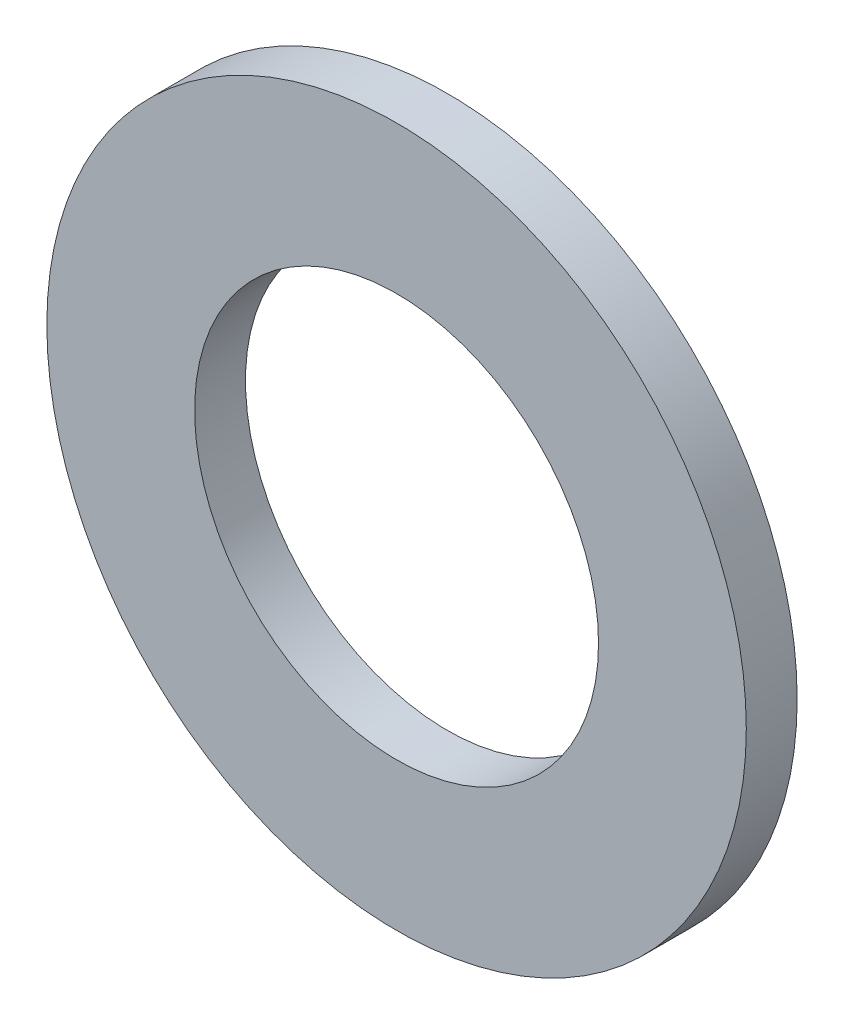
ISO-10303-21;
HEADER;
FILE_DESCRIPTION(('STEP AP214'),'2;1');
FILE_NAME('part.step','',(''),(''),'','','');
FILE_SCHEMA(('AUTOMOTIVE_DESIGN { 1 0 10303 214 1 1 1 1 }'));
ENDSEC;
DATA;
#1=APPLICATION_CONTEXT('core data for automotive mechanical design processes');
#2=APPLICATION_PROTOCOL_DEFINITION('international standard','automotive_design',2000,#1);
#3=PRODUCT_CONTEXT('',#1,'mechanical');
#4=PRODUCT('Part','Part','',(#3));
#5=PRODUCT_RELATED_PRODUCT_CATEGORY('part','',(#4));
#6=PRODUCT_DEFINITION_FORMATION('','',#4);
#7=PRODUCT_DEFINITION_CONTEXT('part definition',#1,'design');
#8=PRODUCT_DEFINITION('design','',#6,#7);
#9=PRODUCT_DEFINITION_SHAPE('','',#8);
#10=(LENGTH_UNIT() NAMED_UNIT(*) SI_UNIT(.MILLI.,.METRE.));
#11=(NAMED_UNIT(*) PLANE_ANGLE_UNIT() SI_UNIT($,.RADIAN.));
#12=(NAMED_UNIT(*) SI_UNIT($,.STERADIAN.) SOLID_ANGLE_UNIT());
#13=UNCERTAINTY_MEASURE_WITH_UNIT(LENGTH_MEASURE(1.E-05),#10,'distance_accuracy_value','');
#14=(GEOMETRIC_REPRESENTATION_CONTEXT(3) GLOBAL_UNCERTAINTY_ASSIGNED_CONTEXT((#13)) GLOBAL_UNIT_ASSIGNED_CONTEXT((#10,
#11,#12)) REPRESENTATION_CONTEXT('',''));
#15=CARTESIAN_POINT('',(0.,0.,0.));
#16=DIRECTION('',(0.,0.,1.));
#17=DIRECTION('',(1.,0.,0.));
#18=AXIS2_PLACEMENT_3D('',#15,#16,#17);
#19=CARTESIAN_POINT('',(0.,0.,-1.27));
#20=DIRECTION('',(0.,0.,1.));
#21=DIRECTION('',(1.,0.,0.));
#22=AXIS2_PLACEMENT_3D('',#19,#20,#21);
#23=CYLINDRICAL_SURFACE('',#22,8.73125);
#24=CARTESIAN_POINT('',(0.,0.,-1.27));
#25=DIRECTION('',(0.,0.,1.));
#26=DIRECTION('',(1.,0.,0.));
#27=AXIS2_PLACEMENT_3D('',#24,#25,#26);
#28=CIRCLE('',#27,8.73125);
#29=CARTESIAN_POINT('',(8.73125,0.,-1.27));
#30=VERTEX_POINT('',#29);
#31=EDGE_CURVE('E10',#30,#30,#28,.T.);
#32=ORIENTED_EDGE('',*,*,#31,.T.);
#33=EDGE_LOOP('',(#32));
#34=FACE_BOUND('',#33,.T.);
#35=CARTESIAN_POINT('',(0.,0.,0.));
#36=DIRECTION('',(0.,0.,1.));
#37=DIRECTION('',(1.,0.,0.));
#38=AXIS2_PLACEMENT_3D('',#35,#36,#37);
#39=CIRCLE('',#38,8.73125);
#40=CARTESIAN_POINT('',(8.73125,0.,0.));
#41=VERTEX_POINT('',#40);
#42=EDGE_CURVE('E35',#41,#41,#39,.T.);
#43=ORIENTED_EDGE('',*,*,#42,.F.);
#44=EDGE_LOOP('',(#43));
#45=FACE_BOUND('',#44,.T.);
#46=ADVANCED_FACE('F32',(#34,#45),#23,.T.);
#47=CARTESIAN_POINT('',(0.,0.,-1.27));
#48=DIRECTION('',(0.,0.,1.));
#49=DIRECTION('',(1.,0.,0.));
#50=AXIS2_PLACEMENT_3D('',#47,#48,#49);
#51=PLANE('',#50);
#52=CARTESIAN_POINT('',(0.,0.,-1.27));
#53=DIRECTION('',(0.,0.,1.));
#54=DIRECTION('',(1.,0.,0.));
#55=AXIS2_PLACEMENT_3D('',#52,#53,#54);
#56=CIRCLE('',#55,5.04189999999999);
#57=CARTESIAN_POINT('',(5.04189999999999,0.,-1.27));
#58=VERTEX_POINT('',#57);
#59=EDGE_CURVE('E42',#58,#58,#56,.T.);
#60=ORIENTED_EDGE('',*,*,#59,.T.);
#61=EDGE_LOOP('',(#60));
#62=FACE_BOUND('',#61,.T.);
#63=ORIENTED_EDGE('',*,*,#31,.F.);
#64=EDGE_LOOP('',(#63));
#65=FACE_BOUND('',#64,.T.);
#66=ADVANCED_FACE('F56',(#62,#65),#51,.F.);
#67=CARTESIAN_POINT('',(0.,0.,0.));
#68=DIRECTION('',(0.,0.,1.));
#69=DIRECTION('',(1.,0.,0.));
#70=AXIS2_PLACEMENT_3D('',#67,#68,#69);
#71=PLANE('',#70);
#72=CARTESIAN_POINT('',(0.,0.,0.));
#73=DIRECTION('',(0.,0.,1.));
#74=DIRECTION('',(1.,0.,0.));
#75=AXIS2_PLACEMENT_3D('',#72,#73,#74);
#76=CIRCLE('',#75,5.04189999999999);
#77=CARTESIAN_POINT('',(5.04189999999999,0.,0.));
#78=VERTEX_POINT('',#77);
#79=EDGE_CURVE('E46',#78,#78,#76,.T.);
#80=ORIENTED_EDGE('',*,*,#79,.F.);
#81=EDGE_LOOP('',(#80));
#82=FACE_BOUND('',#81,.T.);
#83=ORIENTED_EDGE('',*,*,#42,.T.);
#84=EDGE_LOOP('',(#83));
#85=FACE_BOUND('',#84,.T.);
#86=ADVANCED_FACE('F53',(#82,#85),#71,.T.);
#87=CARTESIAN_POINT('',(0.,0.,0.));
#88=DIRECTION('',(0.,0.,1.));
#89=DIRECTION('',(1.,0.,0.));
#90=AXIS2_PLACEMENT_3D('',#87,#88,#89);
#91=CYLINDRICAL_SURFACE('',#90,5.04189999999999);
#92=ORIENTED_EDGE('',*,*,#79,.T.);
#93=EDGE_LOOP('',(#92));
#94=FACE_BOUND('',#93,.T.);
#95=ORIENTED_EDGE('',*,*,#59,.F.);
#96=EDGE_LOOP('',(#95));
#97=FACE_BOUND('',#96,.T.);
#98=ADVANCED_FACE('F50',(#94,#97),#91,.F.);
#99=CLOSED_SHELL('',(#46,#66,#86,#98));
#100=MANIFOLD_SOLID_BREP('B2',#99);
#101=ADVANCED_BREP_SHAPE_REPRESENTATION('',(#18,#100),#14);
#102=SHAPE_DEFINITION_REPRESENTATION(#9,#101);
ENDSEC;
END-ISO-10303-21;
